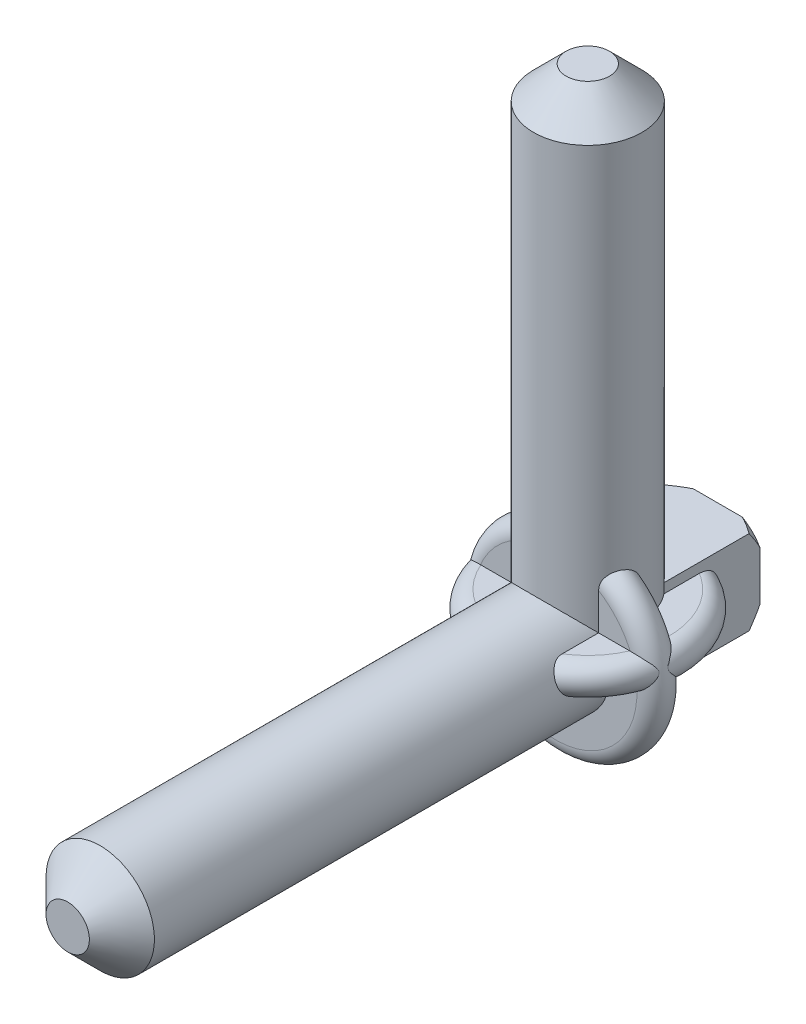
ISO-10303-21;
HEADER;
FILE_DESCRIPTION(('STEP AP214'),'2;1');
FILE_NAME('part.step','',(''),(''),'','','');
FILE_SCHEMA(('AUTOMOTIVE_DESIGN { 1 0 10303 214 1 1 1 1 }'));
ENDSEC;
DATA;
#1=APPLICATION_CONTEXT('core data for automotive mechanical design processes');
#2=APPLICATION_PROTOCOL_DEFINITION('international standard','automotive_design',2000,#1);
#3=PRODUCT_CONTEXT('',#1,'mechanical');
#4=PRODUCT('Part','Part','',(#3));
#5=PRODUCT_RELATED_PRODUCT_CATEGORY('part','',(#4));
#6=PRODUCT_DEFINITION_FORMATION('','',#4);
#7=PRODUCT_DEFINITION_CONTEXT('part definition',#1,'design');
#8=PRODUCT_DEFINITION('design','',#6,#7);
#9=PRODUCT_DEFINITION_SHAPE('','',#8);
#10=(LENGTH_UNIT() NAMED_UNIT(*) SI_UNIT(.MILLI.,.METRE.));
#11=(NAMED_UNIT(*) PLANE_ANGLE_UNIT() SI_UNIT($,.RADIAN.));
#12=(NAMED_UNIT(*) SI_UNIT($,.STERADIAN.) SOLID_ANGLE_UNIT());
#13=UNCERTAINTY_MEASURE_WITH_UNIT(LENGTH_MEASURE(1.E-05),#10,'distance_accuracy_value','');
#14=(GEOMETRIC_REPRESENTATION_CONTEXT(3) GLOBAL_UNCERTAINTY_ASSIGNED_CONTEXT((#13)) GLOBAL_UNIT_ASSIGNED_CONTEXT((#10,
#11,#12)) REPRESENTATION_CONTEXT('',''));
#15=CARTESIAN_POINT('',(0.,0.,0.));
#16=DIRECTION('',(0.,0.,1.));
#17=DIRECTION('',(1.,0.,0.));
#18=AXIS2_PLACEMENT_3D('',#15,#16,#17);
#19=CARTESIAN_POINT('',(0.,1.5,0.));
#20=DIRECTION('',(0.,-1.,0.));
#21=DIRECTION('',(0.,0.,-1.));
#22=AXIS2_PLACEMENT_3D('',#19,#20,#21);
#23=TOROIDAL_SURFACE('',#22,7.5,1.5);
#24=CARTESIAN_POINT('',(0.,0.,0.));
#25=DIRECTION('',(0.,1.,0.));
#26=DIRECTION('',(0.,0.,1.));
#27=AXIS2_PLACEMENT_3D('',#24,#25,#26);
#28=CIRCLE('',#27,7.5);
#29=CARTESIAN_POINT('',(0.,0.,7.5));
#30=VERTEX_POINT('',#29);
#31=EDGE_CURVE('E61',#30,#30,#28,.F.);
#32=ORIENTED_EDGE('',*,*,#31,.F.);
#33=EDGE_LOOP('',(#32));
#34=FACE_BOUND('',#33,.T.);
#35=CARTESIAN_POINT('',(0.,3.,0.));
#36=DIRECTION('',(0.,-1.,0.));
#37=DIRECTION('',(0.,0.,-1.));
#38=AXIS2_PLACEMENT_3D('',#35,#36,#37);
#39=CIRCLE('',#38,7.5);
#40=CARTESIAN_POINT('',(0.,3.,-7.5));
#41=VERTEX_POINT('',#40);
#42=EDGE_CURVE('E12',#41,#41,#39,.F.);
#43=ORIENTED_EDGE('',*,*,#42,.F.);
#44=EDGE_LOOP('',(#43));
#45=FACE_BOUND('',#44,.T.);
#46=ADVANCED_FACE('F54',(#34,#45),#23,.T.);
#47=CARTESIAN_POINT('',(0.,45.,0.));
#48=DIRECTION('',(0.,-1.,0.));
#49=DIRECTION('',(0.,0.,-1.));
#50=AXIS2_PLACEMENT_3D('',#47,#48,#49);
#51=CYLINDRICAL_SURFACE('',#50,5.);
#52=CARTESIAN_POINT('',(0.,42.,0.));
#53=DIRECTION('',(0.,1.,0.));
#54=DIRECTION('',(0.,0.,1.));
#55=AXIS2_PLACEMENT_3D('',#52,#53,#54);
#56=CIRCLE('',#55,5.);
#57=CARTESIAN_POINT('',(0.,42.,-5.));
#58=VERTEX_POINT('',#57);
#59=EDGE_CURVE('E69',#58,#58,#56,.F.);
#60=CARTESIAN_POINT('',(0.,3.,0.));
#61=DIRECTION('',(0.,-1.,0.));
#62=DIRECTION('',(0.,0.,-1.));
#63=AXIS2_PLACEMENT_3D('',#60,#61,#62);
#64=CIRCLE('',#63,5.);
#65=CARTESIAN_POINT('',(0.,3.00000000000001,-5.));
#66=VERTEX_POINT('',#65);
#67=EDGE_CURVE('E65',#66,#66,#64,.T.);
#68=CARTESIAN_POINT('',(0.,42.,-5.));
#69=CARTESIAN_POINT('',(0.,41.59375,-5.));
#70=CARTESIAN_POINT('',(0.,41.1875,-5.));
#71=CARTESIAN_POINT('',(0.,40.375,-5.));
#72=CARTESIAN_POINT('',(0.,39.96875,-5.));
#73=CARTESIAN_POINT('',(0.,39.15625,-5.));
#74=CARTESIAN_POINT('',(0.,38.75,-5.));
#75=CARTESIAN_POINT('',(0.,37.9375,-5.));
#76=CARTESIAN_POINT('',(0.,37.53125,-5.));
#77=CARTESIAN_POINT('',(0.,36.71875,-5.));
#78=CARTESIAN_POINT('',(0.,36.3125,-5.));
#79=CARTESIAN_POINT('',(0.,35.5,-5.));
#80=CARTESIAN_POINT('',(0.,35.09375,-5.));
#81=CARTESIAN_POINT('',(0.,34.28125,-5.));
#82=CARTESIAN_POINT('',(0.,33.875,-5.));
#83=CARTESIAN_POINT('',(0.,33.0625,-5.));
#84=CARTESIAN_POINT('',(0.,32.65625,-5.));
#85=CARTESIAN_POINT('',(0.,31.84375,-5.));
#86=CARTESIAN_POINT('',(0.,31.4375,-5.));
#87=CARTESIAN_POINT('',(0.,30.625,-5.));
#88=CARTESIAN_POINT('',(0.,30.21875,-5.));
#89=CARTESIAN_POINT('',(0.,29.40625,-5.));
#90=CARTESIAN_POINT('',(0.,29.,-5.));
#91=CARTESIAN_POINT('',(0.,28.1875,-5.));
#92=CARTESIAN_POINT('',(0.,27.78125,-5.));
#93=CARTESIAN_POINT('',(0.,26.96875,-5.));
#94=CARTESIAN_POINT('',(0.,26.5625,-5.));
#95=CARTESIAN_POINT('',(0.,25.75,-5.));
#96=CARTESIAN_POINT('',(0.,25.34375,-5.));
#97=CARTESIAN_POINT('',(0.,24.53125,-5.));
#98=CARTESIAN_POINT('',(0.,24.125,-5.));
#99=CARTESIAN_POINT('',(0.,23.3125,-5.));
#100=CARTESIAN_POINT('',(0.,22.90625,-5.));
#101=CARTESIAN_POINT('',(0.,22.09375,-5.));
#102=CARTESIAN_POINT('',(0.,21.6875,-5.));
#103=CARTESIAN_POINT('',(0.,20.875,-5.));
#104=CARTESIAN_POINT('',(0.,20.46875,-5.));
#105=CARTESIAN_POINT('',(0.,19.65625,-5.));
#106=CARTESIAN_POINT('',(0.,19.25,-5.));
#107=CARTESIAN_POINT('',(0.,18.4375,-5.));
#108=CARTESIAN_POINT('',(0.,18.03125,-5.));
#109=CARTESIAN_POINT('',(0.,17.21875,-5.));
#110=CARTESIAN_POINT('',(0.,16.8125,-5.));
#111=CARTESIAN_POINT('',(0.,16.,-5.));
#112=CARTESIAN_POINT('',(0.,15.59375,-5.));
#113=CARTESIAN_POINT('',(0.,14.78125,-5.));
#114=CARTESIAN_POINT('',(0.,14.375,-5.));
#115=CARTESIAN_POINT('',(0.,13.5625,-5.));
#116=CARTESIAN_POINT('',(0.,13.15625,-5.));
#117=CARTESIAN_POINT('',(0.,12.34375,-5.));
#118=CARTESIAN_POINT('',(0.,11.9375,-5.));
#119=CARTESIAN_POINT('',(0.,11.125,-5.));
#120=CARTESIAN_POINT('',(0.,10.71875,-5.));
#121=CARTESIAN_POINT('',(0.,9.90625000000001,-5.));
#122=CARTESIAN_POINT('',(0.,9.50000000000001,-5.));
#123=CARTESIAN_POINT('',(0.,8.68750000000001,-5.));
#124=CARTESIAN_POINT('',(0.,8.28125000000001,-5.));
#125=CARTESIAN_POINT('',(0.,7.46875000000001,-5.));
#126=CARTESIAN_POINT('',(0.,7.06250000000001,-5.));
#127=CARTESIAN_POINT('',(0.,6.25000000000001,-5.));
#128=CARTESIAN_POINT('',(0.,5.84375000000001,-5.));
#129=CARTESIAN_POINT('',(0.,5.03125000000001,-5.));
#130=CARTESIAN_POINT('',(0.,4.62500000000001,-5.));
#131=CARTESIAN_POINT('',(0.,3.81250000000001,-5.));
#132=CARTESIAN_POINT('',(0.,3.40625000000001,-5.));
#133=CARTESIAN_POINT('',(0.,3.00000000000001,-5.));
#134=B_SPLINE_CURVE_WITH_KNOTS('',3,(#68,#69,#70,#71,#72,#73,#74,#75,#76,#77,#78,#79,#80,#81,
#82,#83,#84,#85,#86,#87,#88,#89,#90,#91,#92,#93,#94,#95,#96,#97,#98,#99,#100,#101,#102,#103,
#104,#105,#106,#107,#108,#109,#110,#111,#112,#113,#114,#115,#116,#117,#118,#119,#120,#121,#122,
#123,#124,#125,#126,#127,#128,#129,#130,#131,#132,#133),.UNSPECIFIED.,.F.,.F.,(4,2,2,2,2,2,2,2,
2,2,2,2,2,2,2,2,2,2,2,2,2,2,2,2,2,2,2,2,2,2,2,2,4),(0.,1.21875,2.4375,3.65624999999999,4.875,
6.09374999999999,7.31249999999999,8.53125,9.74999999999999,10.96875,12.1875,13.40625,14.625,
15.84375,17.0625,18.28125,19.5,20.71875,21.9375,23.15625,24.375,25.59375,26.8125,28.03125,29.25,
30.46875,31.6875,32.90625,34.125,35.34375,36.5625,37.78125,39.),.UNSPECIFIED.);
#135=EDGE_CURVE('BSEAM90',#58,#66,#134,.T.);
#136=ORIENTED_EDGE('',*,*,#59,.T.);
#137=ORIENTED_EDGE('',*,*,#67,.F.);
#138=ORIENTED_EDGE('',*,*,#135,.T.);
#139=ORIENTED_EDGE('',*,*,#135,.F.);
#140=EDGE_LOOP('',(#136,#138,#137,#139));
#141=FACE_BOUND('',#140,.T.);
#142=ADVANCED_FACE('F90',(#141),#51,.T.);
#143=CARTESIAN_POINT('',(0.,45.,0.));
#144=DIRECTION('',(0.,1.,0.));
#145=DIRECTION('',(0.,0.,1.));
#146=AXIS2_PLACEMENT_3D('',#143,#144,#145);
#147=PLANE('',#146);
#148=CARTESIAN_POINT('',(0.,45.,0.));
#149=DIRECTION('',(0.,1.,0.));
#150=DIRECTION('',(0.,0.,1.));
#151=AXIS2_PLACEMENT_3D('',#148,#149,#150);
#152=CIRCLE('',#151,2.00000000000002);
#153=CARTESIAN_POINT('',(0.,45.,2.00000000000002));
#154=VERTEX_POINT('',#153);
#155=EDGE_CURVE('E74',#154,#154,#152,.T.);
#156=ORIENTED_EDGE('',*,*,#155,.T.);
#157=EDGE_LOOP('',(#156));
#158=FACE_BOUND('',#157,.T.);
#159=ADVANCED_FACE('F78',(#158),#147,.T.);
#160=CARTESIAN_POINT('',(0.,45.,0.));
#161=DIRECTION('',(0.,-1.,0.));
#162=DIRECTION('',(0.,0.,-1.));
#163=AXIS2_PLACEMENT_3D('',#160,#161,#162);
#164=CONICAL_SURFACE('',#163,2.00000000000002,0.785398163397447);
#165=ORIENTED_EDGE('',*,*,#59,.F.);
#166=EDGE_LOOP('',(#165));
#167=FACE_BOUND('',#166,.T.);
#168=ORIENTED_EDGE('',*,*,#155,.F.);
#169=EDGE_LOOP('',(#168));
#170=FACE_BOUND('',#169,.T.);
#171=ADVANCED_FACE('F80',(#167,#170),#164,.T.);
#172=CARTESIAN_POINT('',(0.,3.,0.));
#173=DIRECTION('',(0.,-1.,0.));
#174=DIRECTION('',(0.,0.,-1.));
#175=AXIS2_PLACEMENT_3D('',#172,#173,#174);
#176=PLANE('',#175);
#177=ORIENTED_EDGE('',*,*,#42,.T.);
#178=EDGE_LOOP('',(#177));
#179=FACE_BOUND('',#178,.T.);
#180=ORIENTED_EDGE('',*,*,#67,.T.);
#181=EDGE_LOOP('',(#180));
#182=FACE_BOUND('',#181,.T.);
#183=ADVANCED_FACE('F82',(#179,#182),#176,.F.);
#184=CARTESIAN_POINT('',(0.,0.,0.));
#185=DIRECTION('',(0.,1.,0.));
#186=DIRECTION('',(0.,0.,1.));
#187=AXIS2_PLACEMENT_3D('',#184,#185,#186);
#188=PLANE('',#187);
#189=ORIENTED_EDGE('',*,*,#31,.T.);
#190=EDGE_LOOP('',(#189));
#191=FACE_BOUND('',#190,.T.);
#192=ADVANCED_FACE('F88',(#191),#188,.F.);
#193=CLOSED_SHELL('',(#46,#142,#159,#171,#183,#192));
#194=MANIFOLD_SOLID_BREP('B2',#193);
#195=CARTESIAN_POINT('',(0.,0.,1.49954257660824));
#196=DIRECTION('',(0.,0.,-1.));
#197=DIRECTION('',(-1.,0.,0.));
#198=AXIS2_PLACEMENT_3D('',#195,#196,#197);
#199=TOROIDAL_SURFACE('',#198,7.53704134094666,1.5);
#200=CARTESIAN_POINT('',(0.,0.,0.));
#201=DIRECTION('',(0.,0.,1.));
#202=DIRECTION('',(1.,0.,0.));
#203=AXIS2_PLACEMENT_3D('',#200,#201,#202);
#204=CIRCLE('',#203,7.57408268189333);
#205=CARTESIAN_POINT('',(7.57408268189333,0.,0.));
#206=VERTEX_POINT('',#205);
#207=EDGE_CURVE('E259',#206,#206,#204,.T.);
#208=ORIENTED_EDGE('',*,*,#207,.T.);
#209=EDGE_LOOP('',(#208));
#210=FACE_BOUND('',#209,.T.);
#211=CARTESIAN_POINT('',(0.,0.,2.99954257660824));
#212=DIRECTION('',(0.,0.,-1.));
#213=DIRECTION('',(-1.,0.,0.));
#214=AXIS2_PLACEMENT_3D('',#211,#212,#213);
#215=CIRCLE('',#214,7.53704134094666);
#216=CARTESIAN_POINT('',(-7.53704134094666,0.,2.99954257660824));
#217=VERTEX_POINT('',#216);
#218=EDGE_CURVE('E269',#217,#217,#215,.T.);
#219=ORIENTED_EDGE('',*,*,#218,.T.);
#220=EDGE_LOOP('',(#219));
#221=FACE_BOUND('',#220,.T.);
#222=ADVANCED_FACE('F159',(#210,#221),#199,.T.);
#223=CARTESIAN_POINT('',(0.,0.,48.));
#224=DIRECTION('',(0.,0.,-1.));
#225=DIRECTION('',(-1.,0.,0.));
#226=AXIS2_PLACEMENT_3D('',#223,#224,#225);
#227=PLANE('',#226);
#228=CARTESIAN_POINT('',(0.,0.,48.));
#229=DIRECTION('',(0.,0.,-1.));
#230=DIRECTION('',(-1.,0.,0.));
#231=AXIS2_PLACEMENT_3D('',#228,#229,#230);
#232=CIRCLE('',#231,2.00000000000001);
#233=CARTESIAN_POINT('',(-2.00000000000001,0.,48.));
#234=VERTEX_POINT('',#233);
#235=EDGE_CURVE('E278',#234,#234,#232,.T.);
#236=ORIENTED_EDGE('',*,*,#235,.F.);
#237=EDGE_LOOP('',(#236));
#238=FACE_BOUND('',#237,.T.);
#239=ADVANCED_FACE('F353',(#238),#227,.F.);
#240=CARTESIAN_POINT('',(0.,0.,48.));
#241=DIRECTION('',(0.,0.,-1.));
#242=DIRECTION('',(-1.,0.,0.));
#243=AXIS2_PLACEMENT_3D('',#240,#241,#242);
#244=CONICAL_SURFACE('',#243,2.00000000000001,0.785398163397446);
#245=CARTESIAN_POINT('',(0.,0.,45.));
#246=DIRECTION('',(0.,0.,-1.));
#247=DIRECTION('',(-1.,0.,0.));
#248=AXIS2_PLACEMENT_3D('',#245,#246,#247);
#249=CIRCLE('',#248,5.);
#250=CARTESIAN_POINT('',(-4.99999999999999,0.,45.));
#251=VERTEX_POINT('',#250);
#252=EDGE_CURVE('E275',#251,#251,#249,.T.);
#253=ORIENTED_EDGE('',*,*,#252,.F.);
#254=EDGE_LOOP('',(#253));
#255=FACE_BOUND('',#254,.T.);
#256=ORIENTED_EDGE('',*,*,#235,.T.);
#257=EDGE_LOOP('',(#256));
#258=FACE_BOUND('',#257,.T.);
#259=ADVANCED_FACE('F358',(#255,#258),#244,.T.);
#260=CARTESIAN_POINT('',(0.,0.,0.));
#261=DIRECTION('',(0.,0.,-1.));
#262=DIRECTION('',(-1.,0.,0.));
#263=AXIS2_PLACEMENT_3D('',#260,#261,#262);
#264=CYLINDRICAL_SURFACE('',#263,5.);
#265=CARTESIAN_POINT('',(0.,0.,2.99954257660824));
#266=DIRECTION('',(0.,0.,-1.));
#267=DIRECTION('',(-1.,0.,0.));
#268=AXIS2_PLACEMENT_3D('',#265,#266,#267);
#269=CIRCLE('',#268,4.99999999999999);
#270=CARTESIAN_POINT('',(-4.99999999999999,0.,2.99954257660824));
#271=VERTEX_POINT('',#270);
#272=EDGE_CURVE('E272',#271,#271,#269,.T.);
#273=ORIENTED_EDGE('',*,*,#272,.F.);
#274=EDGE_LOOP('',(#273));
#275=FACE_BOUND('',#274,.T.);
#276=ORIENTED_EDGE('',*,*,#252,.T.);
#277=EDGE_LOOP('',(#276));
#278=FACE_BOUND('',#277,.T.);
#279=ADVANCED_FACE('F368',(#275,#278),#264,.T.);
#280=CARTESIAN_POINT('',(-4.99999999999999,0.,2.99954257660824));
#281=DIRECTION('',(0.,0.,-1.));
#282=DIRECTION('',(-1.,0.,0.));
#283=AXIS2_PLACEMENT_3D('',#280,#281,#282);
#284=PLANE('',#283);
#285=ORIENTED_EDGE('',*,*,#218,.F.);
#286=EDGE_LOOP('',(#285));
#287=FACE_BOUND('',#286,.T.);
#288=ORIENTED_EDGE('',*,*,#272,.T.);
#289=EDGE_LOOP('',(#288));
#290=FACE_BOUND('',#289,.T.);
#291=ADVANCED_FACE('F364',(#287,#290),#284,.F.);
#292=CARTESIAN_POINT('',(-7.5,0.,0.));
#293=DIRECTION('',(0.,0.,1.));
#294=DIRECTION('',(1.,0.,0.));
#295=AXIS2_PLACEMENT_3D('',#292,#293,#294);
#296=PLANE('',#295);
#297=DIRECTION('',(0.,-1.,0.));
#298=VECTOR('',#297,1.);
#299=CARTESIAN_POINT('',(3.88908729652601,3.88908729652601,0.));
#300=LINE('',#299,#298);
#301=CARTESIAN_POINT('',(3.88908729652601,3.88908729652601,0.));
#302=VERTEX_POINT('',#301);
#303=CARTESIAN_POINT('',(3.88908729652601,-3.88908729652601,0.));
#304=VERTEX_POINT('',#303);
#305=EDGE_CURVE('E246',#302,#304,#300,.T.);
#306=ORIENTED_EDGE('',*,*,#305,.F.);
#307=DIRECTION('',(1.,0.,0.));
#308=VECTOR('',#307,1.);
#309=CARTESIAN_POINT('',(3.88908729652601,3.88908729652601,0.));
#310=LINE('',#309,#308);
#311=CARTESIAN_POINT('',(-3.88908729652601,3.88908729652601,0.));
#312=VERTEX_POINT('',#311);
#313=EDGE_CURVE('E183',#312,#302,#310,.T.);
#314=ORIENTED_EDGE('',*,*,#313,.F.);
#315=DIRECTION('',(0.,1.,0.));
#316=VECTOR('',#315,1.);
#317=CARTESIAN_POINT('',(-3.88908729652601,3.88908729652601,0.));
#318=LINE('',#317,#316);
#319=CARTESIAN_POINT('',(-3.88908729652601,-3.88908729652601,0.));
#320=VERTEX_POINT('',#319);
#321=EDGE_CURVE('E243',#320,#312,#318,.T.);
#322=ORIENTED_EDGE('',*,*,#321,.F.);
#323=DIRECTION('',(-1.,0.,0.));
#324=VECTOR('',#323,1.);
#325=CARTESIAN_POINT('',(3.88908729652601,-3.88908729652601,0.));
#326=LINE('',#325,#324);
#327=EDGE_CURVE('E252',#304,#320,#326,.T.);
#328=ORIENTED_EDGE('',*,*,#327,.F.);
#329=EDGE_LOOP('',(#306,#314,#322,#328));
#330=FACE_BOUND('',#329,.T.);
#331=ORIENTED_EDGE('',*,*,#207,.F.);
#332=EDGE_LOOP('',(#331));
#333=FACE_BOUND('',#332,.T.);
#334=ADVANCED_FACE('F241',(#330,#333),#296,.F.);
#335=CARTESIAN_POINT('',(3.88908729652601,3.88908729652601,25.8162189847481));
#336=DIRECTION('',(0.,1.,0.));
#337=DIRECTION('',(0.,0.,1.));
#338=AXIS2_PLACEMENT_3D('',#335,#336,#337);
#339=PLANE('',#338);
#340=DIRECTION('',(0.,0.,-1.));
#341=VECTOR('',#340,1.);
#342=CARTESIAN_POINT('',(-3.88908729652601,3.88908729652601,25.8162189847481));
#343=LINE('',#342,#341);
#344=CARTESIAN_POINT('',(-3.88908729652601,3.88908729652601,-11.));
#345=VERTEX_POINT('',#344);
#346=EDGE_CURVE('E230',#312,#345,#343,.T.);
#347=ORIENTED_EDGE('',*,*,#346,.F.);
#348=ORIENTED_EDGE('',*,*,#313,.T.);
#349=DIRECTION('',(0.,0.,-1.));
#350=VECTOR('',#349,1.);
#351=CARTESIAN_POINT('',(3.88908729652601,3.88908729652601,25.8162189847481));
#352=LINE('',#351,#350);
#353=CARTESIAN_POINT('',(3.88908729652601,3.88908729652601,-11.));
#354=VERTEX_POINT('',#353);
#355=EDGE_CURVE('E188',#302,#354,#352,.T.);
#356=ORIENTED_EDGE('',*,*,#355,.T.);
#357=CARTESIAN_POINT('',(-3.88978729652601,3.88908729652601,-10.9995050029824));
#358=CARTESIAN_POINT('',(-3.78108369336855,3.88908729652601,-11.0763519078416));
#359=CARTESIAN_POINT('',(-3.67163260877479,3.88908729652601,-11.1521649922041));
#360=CARTESIAN_POINT('',(-3.45093033281997,3.88908729652601,-11.3012287873298));
#361=CARTESIAN_POINT('',(-3.33967835451337,3.88908729652601,-11.3744783311237));
#362=CARTESIAN_POINT('',(-3.11376459857949,3.88908729652601,-11.5187454667472));
#363=CARTESIAN_POINT('',(-2.99907758942493,3.88908729652601,-11.5897237645149));
#364=CARTESIAN_POINT('',(-2.76736027517317,3.88908729652601,-11.727724627306));
#365=CARTESIAN_POINT('',(-2.65033023979367,3.88908729652601,-11.7947476441753));
#366=CARTESIAN_POINT('',(-2.40987073792604,3.88908729652601,-11.9259406979572));
#367=CARTESIAN_POINT('',(-2.28635560527038,3.88908729652601,-11.9899559053949));
#368=CARTESIAN_POINT('',(-2.03618307879466,3.88908729652601,-12.1114857471477));
#369=CARTESIAN_POINT('',(-1.9095250936363,3.88908729652601,-12.1689991466409));
#370=CARTESIAN_POINT('',(-1.525608164993,3.88908729652601,-12.3288271806211));
#371=CARTESIAN_POINT('',(-1.26295503167271,3.88908729652601,-12.4192622779044));
#372=CARTESIAN_POINT('',(-0.867412663725976,3.88908729652601,-12.5172571812076));
#373=CARTESIAN_POINT('',(-0.739063924774483,3.88908729652601,-12.5433775346429));
#374=CARTESIAN_POINT('',(-0.480394446215664,3.88908729652601,-12.5834351359055));
#375=CARTESIAN_POINT('',(-0.350073282693113,3.88908729652601,-12.5973697258187));
#376=CARTESIAN_POINT('',(-0.0905175397892483,3.88908729652601,-12.6119873684757));
#377=CARTESIAN_POINT('',(0.0387066140747044,3.88908729652601,-12.6128536862105));
#378=CARTESIAN_POINT('',(0.296593475126116,3.88908729652601,-12.6017480484666));
#379=CARTESIAN_POINT('',(0.425256179667228,3.88908729652601,-12.5897760325409));
#380=CARTESIAN_POINT('',(0.679965963744885,3.88908729652601,-12.5539197818217));
#381=CARTESIAN_POINT('',(0.806025005448717,3.88908729652601,-12.5301188904681));
#382=CARTESIAN_POINT('',(1.05573497768834,3.88908729652601,-12.4719970012519));
#383=CARTESIAN_POINT('',(1.17938440235939,3.88908729652601,-12.4376696358967));
#384=CARTESIAN_POINT('',(1.42539134157302,3.88908729652601,-12.3595958129107));
#385=CARTESIAN_POINT('',(1.54771168374905,3.88908729652601,-12.315733694317));
#386=CARTESIAN_POINT('',(1.78932464784705,3.88908729652601,-12.2204721519484));
#387=CARTESIAN_POINT('',(1.90861770691972,3.88908729652601,-12.169073823779));
#388=CARTESIAN_POINT('',(2.19351522202659,3.88908729652601,-12.0374301943781));
#389=CARTESIAN_POINT('',(2.35768516455932,3.88908729652601,-11.9540939987656));
#390=CARTESIAN_POINT('',(2.68109944528291,3.88908729652601,-11.7782552552018));
#391=CARTESIAN_POINT('',(2.8403404830074,3.88908729652601,-11.6857467324143));
#392=CARTESIAN_POINT('',(3.14985005595836,3.88908729652601,-11.4968010585993));
#393=CARTESIAN_POINT('',(3.30024422234143,3.88908729652601,-11.4005684052412));
#394=CARTESIAN_POINT('',(3.52323025103755,3.88908729652601,-11.252612192772));
#395=CARTESIAN_POINT('',(3.59706112925623,3.88908729652601,-11.2027375542533));
#396=CARTESIAN_POINT('',(3.74396924633303,3.88908729652601,-11.1019023782328));
#397=CARTESIAN_POINT('',(3.81704654581192,3.88908729652601,-11.0509419291051));
#398=CARTESIAN_POINT('',(3.88978729652601,3.88908729652601,-10.9995050029824));
#399=B_SPLINE_CURVE_WITH_KNOTS('',3,(#357,#358,#359,#360,#361,#362,#363,#364,#365,#366,#367,
#368,#369,#370,#371,#372,#373,#374,#375,#376,#377,#378,#379,#380,#381,#382,#383,#384,#385,#386,
#387,#388,#389,#390,#391,#392,#393,#394,#395,#396,#397,#398),.UNSPECIFIED.,.F.,.F.,(4,2,2,2,2,2,
2,2,2,2,2,2,2,2,2,2,2,2,2,2,4),(0.,0.399384944315372,0.798949391548146,1.20350341944569,
1.60801114183076,2.02517246102459,2.44241287477624,3.27189771118466,3.66435868136198,
4.05690523234999,4.44394164406653,4.83097987808236,5.21532898974421,5.59991105538195,
5.98944824008372,6.37892885036908,6.93084202725827,7.48311711122266,8.01862763050061,
8.28591460136134,8.55317990021174),.UNSPECIFIED.);
#400=CARTESIAN_POINT('',(2.26384628453435,3.88908729652601,-12.));
#401=VERTEX_POINT('',#400);
#402=EDGE_CURVE('E285',#401,#354,#399,.T.);
#403=ORIENTED_EDGE('',*,*,#402,.F.);
#404=DIRECTION('',(1.,0.,0.));
#405=VECTOR('',#404,1.);
#406=CARTESIAN_POINT('',(3.88908729652601,3.88908729652601,-12.));
#407=LINE('',#406,#405);
#408=CARTESIAN_POINT('',(-2.26384628453435,3.88908729652601,-12.));
#409=VERTEX_POINT('',#408);
#410=EDGE_CURVE('E237',#409,#401,#407,.T.);
#411=ORIENTED_EDGE('',*,*,#410,.F.);
#412=EDGE_CURVE('E233',#345,#409,#399,.T.);
#413=ORIENTED_EDGE('',*,*,#412,.F.);
#414=EDGE_LOOP('',(#347,#348,#356,#403,#411,#413));
#415=FACE_BOUND('',#414,.T.);
#416=ADVANCED_FACE('F231',(#415),#339,.T.);
#417=CARTESIAN_POINT('',(3.88908729652601,3.88908729652601,25.8162189847481));
#418=DIRECTION('',(1.,0.,0.));
#419=DIRECTION('',(0.,0.,-1.));
#420=AXIS2_PLACEMENT_3D('',#417,#418,#419);
#421=PLANE('',#420);
#422=ORIENTED_EDGE('',*,*,#355,.F.);
#423=ORIENTED_EDGE('',*,*,#305,.T.);
#424=DIRECTION('',(0.,0.,-1.));
#425=VECTOR('',#424,1.);
#426=CARTESIAN_POINT('',(3.88908729652601,-3.88908729652601,25.8162189847481));
#427=LINE('',#426,#425);
#428=CARTESIAN_POINT('',(3.88908729652601,-3.88908729652601,-11.));
#429=VERTEX_POINT('',#428);
#430=EDGE_CURVE('E262',#304,#429,#427,.T.);
#431=ORIENTED_EDGE('',*,*,#430,.T.);
#432=CARTESIAN_POINT('',(3.88908729652601,3.88978729652601,-10.9995050029824));
#433=CARTESIAN_POINT('',(3.88908729652601,3.78108369336854,-11.0763519078416));
#434=CARTESIAN_POINT('',(3.88908729652601,3.67163260877478,-11.1521649922041));
#435=CARTESIAN_POINT('',(3.88908729652601,3.45093033281996,-11.3012287873298));
#436=CARTESIAN_POINT('',(3.88908729652601,3.33967835451337,-11.3744783311237));
#437=CARTESIAN_POINT('',(3.88908729652601,3.11376459857949,-11.5187454667472));
#438=CARTESIAN_POINT('',(3.88908729652601,2.99907758942493,-11.5897237645149));
#439=CARTESIAN_POINT('',(3.88908729652601,2.76736027517317,-11.727724627306));
#440=CARTESIAN_POINT('',(3.88908729652601,2.65033023979366,-11.7947476441753));
#441=CARTESIAN_POINT('',(3.88908729652601,2.40987073792604,-11.9259406979572));
#442=CARTESIAN_POINT('',(3.88908729652601,2.28635560527038,-11.9899559053949));
#443=CARTESIAN_POINT('',(3.88908729652601,2.03618307879466,-12.1114857471477));
#444=CARTESIAN_POINT('',(3.88908729652601,1.9095250936363,-12.1689991466409));
#445=CARTESIAN_POINT('',(3.88908729652601,1.52560816499299,-12.3288271806211));
#446=CARTESIAN_POINT('',(3.88908729652601,1.26295503167271,-12.4192622779044));
#447=CARTESIAN_POINT('',(3.88908729652601,0.867412663725975,-12.5172571812076));
#448=CARTESIAN_POINT('',(3.88908729652601,0.739063924774482,-12.5433775346429));
#449=CARTESIAN_POINT('',(3.88908729652601,0.480394446215663,-12.5834351359055));
#450=CARTESIAN_POINT('',(3.88908729652601,0.350073282693111,-12.5973697258187));
#451=CARTESIAN_POINT('',(3.88908729652601,0.0905175397892465,-12.6119873684757));
#452=CARTESIAN_POINT('',(3.88908729652601,-0.0387066140747065,-12.6128536862105));
#453=CARTESIAN_POINT('',(3.88908729652601,-0.296593475126118,-12.6017480484666));
#454=CARTESIAN_POINT('',(3.88908729652601,-0.42525617966723,-12.5897760325409));
#455=CARTESIAN_POINT('',(3.88908729652601,-0.679965963744886,-12.5539197818217));
#456=CARTESIAN_POINT('',(3.88908729652601,-0.806025005448718,-12.5301188904681));
#457=CARTESIAN_POINT('',(3.88908729652601,-1.05573497768834,-12.4719970012519));
#458=CARTESIAN_POINT('',(3.88908729652601,-1.17938440235939,-12.4376696358967));
#459=CARTESIAN_POINT('',(3.88908729652601,-1.42539134157302,-12.3595958129108));
#460=CARTESIAN_POINT('',(3.88908729652601,-1.54771168374905,-12.315733694317));
#461=CARTESIAN_POINT('',(3.88908729652601,-1.78932464784705,-12.2204721519484));
#462=CARTESIAN_POINT('',(3.88908729652601,-1.90861770691972,-12.169073823779));
#463=CARTESIAN_POINT('',(3.88908729652601,-2.19351522202659,-12.0374301943781));
#464=CARTESIAN_POINT('',(3.88908729652601,-2.35768516455932,-11.9540939987656));
#465=CARTESIAN_POINT('',(3.88908729652601,-2.68109944528292,-11.7782552552018));
#466=CARTESIAN_POINT('',(3.88908729652601,-2.8403404830074,-11.6857467324143));
#467=CARTESIAN_POINT('',(3.88908729652601,-3.14985005595837,-11.4968010585993));
#468=CARTESIAN_POINT('',(3.88908729652601,-3.30024422234143,-11.4005684052412));
#469=CARTESIAN_POINT('',(3.88908729652601,-3.52323025103755,-11.252612192772));
#470=CARTESIAN_POINT('',(3.88908729652601,-3.59706112925623,-11.2027375542533));
#471=CARTESIAN_POINT('',(3.88908729652601,-3.74396924633303,-11.1019023782328));
#472=CARTESIAN_POINT('',(3.88908729652601,-3.81704654581192,-11.0509419291051));
#473=CARTESIAN_POINT('',(3.88908729652601,-3.88978729652601,-10.9995050029824));
#474=B_SPLINE_CURVE_WITH_KNOTS('',3,(#432,#433,#434,#435,#436,#437,#438,#439,#440,#441,#442,
#443,#444,#445,#446,#447,#448,#449,#450,#451,#452,#453,#454,#455,#456,#457,#458,#459,#460,#461,
#462,#463,#464,#465,#466,#467,#468,#469,#470,#471,#472,#473),.UNSPECIFIED.,.F.,.F.,(4,2,2,2,2,2,
2,2,2,2,2,2,2,2,2,2,2,2,2,2,4),(0.,0.399384944315371,0.798949391548146,1.20350341944569,
1.60801114183076,2.02517246102459,2.44241287477624,3.27189771118466,3.66435868136198,
4.05690523234999,4.44394164406653,4.83097987808236,5.2153289897442,5.59991105538195,
5.98944824008372,6.37892885036908,6.93084202725827,7.48311711122266,8.01862763050061,
8.28591460136134,8.55317990021174),.UNSPECIFIED.);
#475=CARTESIAN_POINT('',(3.88908729652601,-2.26384628453435,-12.));
#476=VERTEX_POINT('',#475);
#477=EDGE_CURVE('E321',#476,#429,#474,.T.);
#478=ORIENTED_EDGE('',*,*,#477,.F.);
#479=DIRECTION('',(0.,-1.,0.));
#480=VECTOR('',#479,1.);
#481=CARTESIAN_POINT('',(3.88908729652601,3.88908729652601,-12.));
#482=LINE('',#481,#480);
#483=CARTESIAN_POINT('',(3.88908729652601,2.26384628453435,-12.));
#484=VERTEX_POINT('',#483);
#485=EDGE_CURVE('E238',#484,#476,#482,.T.);
#486=ORIENTED_EDGE('',*,*,#485,.F.);
#487=EDGE_CURVE('E294',#354,#484,#474,.T.);
#488=ORIENTED_EDGE('',*,*,#487,.F.);
#489=EDGE_LOOP('',(#422,#423,#431,#478,#486,#488));
#490=FACE_BOUND('',#489,.T.);
#491=ADVANCED_FACE('F302',(#490),#421,.T.);
#492=CARTESIAN_POINT('',(3.88908729652601,-3.88908729652601,25.8162189847481));
#493=DIRECTION('',(0.,-1.,0.));
#494=DIRECTION('',(0.,0.,-1.));
#495=AXIS2_PLACEMENT_3D('',#492,#493,#494);
#496=PLANE('',#495);
#497=ORIENTED_EDGE('',*,*,#430,.F.);
#498=ORIENTED_EDGE('',*,*,#327,.T.);
#499=DIRECTION('',(0.,0.,-1.));
#500=VECTOR('',#499,1.);
#501=CARTESIAN_POINT('',(-3.88908729652601,-3.88908729652601,25.8162189847481));
#502=LINE('',#501,#500);
#503=CARTESIAN_POINT('',(-3.88908729652601,-3.88908729652601,-11.));
#504=VERTEX_POINT('',#503);
#505=EDGE_CURVE('E250',#320,#504,#502,.T.);
#506=ORIENTED_EDGE('',*,*,#505,.T.);
#507=CARTESIAN_POINT('',(3.88978729652601,-3.88908729652601,-10.9995050029824));
#508=CARTESIAN_POINT('',(3.78108369336854,-3.88908729652601,-11.0763519078416));
#509=CARTESIAN_POINT('',(3.67163260877478,-3.88908729652601,-11.1521649922041));
#510=CARTESIAN_POINT('',(3.45093033281996,-3.88908729652601,-11.3012287873298));
#511=CARTESIAN_POINT('',(3.33967835451337,-3.88908729652601,-11.3744783311237));
#512=CARTESIAN_POINT('',(3.11376459857949,-3.88908729652601,-11.5187454667472));
#513=CARTESIAN_POINT('',(2.99907758942492,-3.88908729652601,-11.5897237645149));
#514=CARTESIAN_POINT('',(2.76736027517317,-3.88908729652601,-11.727724627306));
#515=CARTESIAN_POINT('',(2.65033023979366,-3.88908729652601,-11.7947476441753));
#516=CARTESIAN_POINT('',(2.40987073792604,-3.88908729652601,-11.9259406979572));
#517=CARTESIAN_POINT('',(2.28635560527038,-3.88908729652601,-11.9899559053949));
#518=CARTESIAN_POINT('',(2.03618307879466,-3.88908729652601,-12.1114857471477));
#519=CARTESIAN_POINT('',(1.90952509363629,-3.88908729652601,-12.1689991466409));
#520=CARTESIAN_POINT('',(1.52560816499299,-3.88908729652601,-12.3288271806211));
#521=CARTESIAN_POINT('',(1.2629550316727,-3.88908729652601,-12.4192622779044));
#522=CARTESIAN_POINT('',(0.867412663725972,-3.88908729652601,-12.5172571812076));
#523=CARTESIAN_POINT('',(0.739063924774478,-3.88908729652601,-12.5433775346429));
#524=CARTESIAN_POINT('',(0.480394446215659,-3.88908729652601,-12.5834351359055));
#525=CARTESIAN_POINT('',(0.350073282693107,-3.88908729652601,-12.5973697258187));
#526=CARTESIAN_POINT('',(0.0905175397892425,-3.88908729652601,-12.6119873684756));
#527=CARTESIAN_POINT('',(-0.0387066140747102,-3.88908729652601,-12.6128536862105));
#528=CARTESIAN_POINT('',(-0.296593475126122,-3.88908729652601,-12.6017480484666));
#529=CARTESIAN_POINT('',(-0.425256179667234,-3.88908729652601,-12.5897760325409));
#530=CARTESIAN_POINT('',(-0.679965963744891,-3.88908729652601,-12.5539197818217));
#531=CARTESIAN_POINT('',(-0.806025005448722,-3.88908729652601,-12.5301188904681));
#532=CARTESIAN_POINT('',(-1.05573497768835,-3.88908729652601,-12.4719970012519));
#533=CARTESIAN_POINT('',(-1.1793844023594,-3.88908729652601,-12.4376696358967));
#534=CARTESIAN_POINT('',(-1.42539134157302,-3.88908729652601,-12.3595958129107));
#535=CARTESIAN_POINT('',(-1.54771168374905,-3.88908729652601,-12.315733694317));
#536=CARTESIAN_POINT('',(-1.78932464784706,-3.88908729652601,-12.2204721519484));
#537=CARTESIAN_POINT('',(-1.90861770691972,-3.88908729652601,-12.169073823779));
#538=CARTESIAN_POINT('',(-2.1935152220266,-3.88908729652601,-12.0374301943781));
#539=CARTESIAN_POINT('',(-2.35768516455932,-3.88908729652601,-11.9540939987656));
#540=CARTESIAN_POINT('',(-2.68109944528292,-3.88908729652601,-11.7782552552018));
#541=CARTESIAN_POINT('',(-2.84034048300741,-3.88908729652601,-11.6857467324143));
#542=CARTESIAN_POINT('',(-3.14985005595837,-3.88908729652601,-11.4968010585993));
#543=CARTESIAN_POINT('',(-3.30024422234144,-3.88908729652601,-11.4005684052412));
#544=CARTESIAN_POINT('',(-3.52323025103756,-3.88908729652601,-11.252612192772));
#545=CARTESIAN_POINT('',(-3.59706112925624,-3.88908729652601,-11.2027375542533));
#546=CARTESIAN_POINT('',(-3.74396924633303,-3.88908729652601,-11.1019023782328));
#547=CARTESIAN_POINT('',(-3.81704654581193,-3.88908729652601,-11.0509419291051));
#548=CARTESIAN_POINT('',(-3.88978729652601,-3.88908729652601,-10.9995050029824));
#549=B_SPLINE_CURVE_WITH_KNOTS('',3,(#507,#508,#509,#510,#511,#512,#513,#514,#515,#516,#517,
#518,#519,#520,#521,#522,#523,#524,#525,#526,#527,#528,#529,#530,#531,#532,#533,#534,#535,#536,
#537,#538,#539,#540,#541,#542,#543,#544,#545,#546,#547,#548),.UNSPECIFIED.,.F.,.F.,(4,2,2,2,2,2,
2,2,2,2,2,2,2,2,2,2,2,2,2,2,4),(0.,0.399384944315371,0.798949391548146,1.20350341944569,
1.60801114183076,2.02517246102459,2.44241287477624,3.27189771118466,3.66435868136198,
4.05690523234999,4.44394164406653,4.83097987808236,5.21532898974421,5.59991105538195,
5.98944824008372,6.37892885036908,6.93084202725827,7.48311711122266,8.01862763050061,
8.28591460136134,8.55317990021174),.UNSPECIFIED.);
#550=CARTESIAN_POINT('',(-2.26384628453435,-3.88908729652601,-12.));
#551=VERTEX_POINT('',#550);
#552=EDGE_CURVE('E175',#551,#504,#549,.T.);
#553=ORIENTED_EDGE('',*,*,#552,.F.);
#554=DIRECTION('',(-1.,0.,0.));
#555=VECTOR('',#554,1.);
#556=CARTESIAN_POINT('',(3.88908729652601,-3.88908729652601,-12.));
#557=LINE('',#556,#555);
#558=CARTESIAN_POINT('',(2.26384628453435,-3.88908729652601,-12.));
#559=VERTEX_POINT('',#558);
#560=EDGE_CURVE('E265',#559,#551,#557,.T.);
#561=ORIENTED_EDGE('',*,*,#560,.F.);
#562=EDGE_CURVE('E165',#429,#559,#549,.T.);
#563=ORIENTED_EDGE('',*,*,#562,.F.);
#564=EDGE_LOOP('',(#497,#498,#506,#553,#561,#563));
#565=FACE_BOUND('',#564,.T.);
#566=ADVANCED_FACE('F305',(#565),#496,.T.);
#567=CARTESIAN_POINT('',(-3.88908729652601,3.88908729652601,25.8162189847481));
#568=DIRECTION('',(-1.,0.,0.));
#569=DIRECTION('',(0.,0.,1.));
#570=AXIS2_PLACEMENT_3D('',#567,#568,#569);
#571=PLANE('',#570);
#572=ORIENTED_EDGE('',*,*,#505,.F.);
#573=ORIENTED_EDGE('',*,*,#321,.T.);
#574=ORIENTED_EDGE('',*,*,#346,.T.);
#575=CARTESIAN_POINT('',(-3.88908729652601,-3.88978729652601,-10.9995050029824));
#576=CARTESIAN_POINT('',(-3.88908729652601,-3.78108369336854,-11.0763519078416));
#577=CARTESIAN_POINT('',(-3.88908729652601,-3.67163260877478,-11.1521649922041));
#578=CARTESIAN_POINT('',(-3.88908729652601,-3.45093033281996,-11.3012287873298));
#579=CARTESIAN_POINT('',(-3.88908729652601,-3.33967835451337,-11.3744783311237));
#580=CARTESIAN_POINT('',(-3.88908729652601,-3.11376459857949,-11.5187454667472));
#581=CARTESIAN_POINT('',(-3.88908729652601,-2.99907758942493,-11.5897237645149));
#582=CARTESIAN_POINT('',(-3.88908729652601,-2.76736027517317,-11.727724627306));
#583=CARTESIAN_POINT('',(-3.88908729652601,-2.65033023979366,-11.7947476441753));
#584=CARTESIAN_POINT('',(-3.88908729652601,-2.40987073792604,-11.9259406979572));
#585=CARTESIAN_POINT('',(-3.88908729652601,-2.28635560527038,-11.9899559053949));
#586=CARTESIAN_POINT('',(-3.88908729652601,-2.03618307879466,-12.1114857471477));
#587=CARTESIAN_POINT('',(-3.88908729652601,-1.9095250936363,-12.1689991466409));
#588=CARTESIAN_POINT('',(-3.88908729652601,-1.52560816499299,-12.3288271806211));
#589=CARTESIAN_POINT('',(-3.88908729652601,-1.2629550316727,-12.4192622779044));
#590=CARTESIAN_POINT('',(-3.88908729652601,-0.867412663725973,-12.5172571812076));
#591=CARTESIAN_POINT('',(-3.88908729652601,-0.739063924774479,-12.5433775346429));
#592=CARTESIAN_POINT('',(-3.88908729652601,-0.48039444621566,-12.5834351359055));
#593=CARTESIAN_POINT('',(-3.88908729652601,-0.350073282693109,-12.5973697258187));
#594=CARTESIAN_POINT('',(-3.88908729652601,-0.0905175397892436,-12.6119873684756));
#595=CARTESIAN_POINT('',(-3.88908729652601,0.0387066140747093,-12.6128536862105));
#596=CARTESIAN_POINT('',(-3.88908729652601,0.296593475126121,-12.6017480484666));
#597=CARTESIAN_POINT('',(-3.88908729652601,0.425256179667233,-12.5897760325409));
#598=CARTESIAN_POINT('',(-3.88908729652601,0.67996596374489,-12.5539197818217));
#599=CARTESIAN_POINT('',(-3.88908729652601,0.806025005448722,-12.5301188904681));
#600=CARTESIAN_POINT('',(-3.88908729652601,1.05573497768835,-12.4719970012519));
#601=CARTESIAN_POINT('',(-3.88908729652601,1.1793844023594,-12.4376696358967));
#602=CARTESIAN_POINT('',(-3.88908729652601,1.42539134157302,-12.3595958129107));
#603=CARTESIAN_POINT('',(-3.88908729652601,1.54771168374905,-12.315733694317));
#604=CARTESIAN_POINT('',(-3.88908729652601,1.78932464784706,-12.2204721519484));
#605=CARTESIAN_POINT('',(-3.88908729652601,1.90861770691972,-12.169073823779));
#606=CARTESIAN_POINT('',(-3.88908729652601,2.1935152220266,-12.0374301943781));
#607=CARTESIAN_POINT('',(-3.88908729652601,2.35768516455932,-11.9540939987656));
#608=CARTESIAN_POINT('',(-3.88908729652601,2.68109944528292,-11.7782552552018));
#609=CARTESIAN_POINT('',(-3.88908729652601,2.8403404830074,-11.6857467324143));
#610=CARTESIAN_POINT('',(-3.88908729652601,3.14985005595837,-11.4968010585993));
#611=CARTESIAN_POINT('',(-3.88908729652601,3.30024422234143,-11.4005684052412));
#612=CARTESIAN_POINT('',(-3.88908729652601,3.52323025103755,-11.252612192772));
#613=CARTESIAN_POINT('',(-3.88908729652601,3.59706112925623,-11.2027375542533));
#614=CARTESIAN_POINT('',(-3.88908729652601,3.74396924633303,-11.1019023782328));
#615=CARTESIAN_POINT('',(-3.88908729652601,3.81704654581192,-11.0509419291051));
#616=CARTESIAN_POINT('',(-3.88908729652601,3.88978729652601,-10.9995050029824));
#617=B_SPLINE_CURVE_WITH_KNOTS('',3,(#575,#576,#577,#578,#579,#580,#581,#582,#583,#584,#585,
#586,#587,#588,#589,#590,#591,#592,#593,#594,#595,#596,#597,#598,#599,#600,#601,#602,#603,#604,
#605,#606,#607,#608,#609,#610,#611,#612,#613,#614,#615,#616),.UNSPECIFIED.,.F.,.F.,(4,2,2,2,2,2,
2,2,2,2,2,2,2,2,2,2,2,2,2,2,4),(0.,0.399384944315372,0.798949391548145,1.20350341944569,
1.60801114183076,2.02517246102459,2.44241287477624,3.27189771118466,3.66435868136198,
4.05690523234999,4.44394164406653,4.83097987808236,5.21532898974421,5.59991105538196,
5.98944824008373,6.37892885036908,6.93084202725827,7.48311711122266,8.01862763050061,
8.28591460136134,8.55317990021174),.UNSPECIFIED.);
#618=CARTESIAN_POINT('',(-3.88908729652601,2.26384628453434,-12.));
#619=VERTEX_POINT('',#618);
#620=EDGE_CURVE('E176',#619,#345,#617,.T.);
#621=ORIENTED_EDGE('',*,*,#620,.F.);
#622=DIRECTION('',(0.,1.,0.));
#623=VECTOR('',#622,1.);
#624=CARTESIAN_POINT('',(-3.88908729652601,3.88908729652601,-12.));
#625=LINE('',#624,#623);
#626=CARTESIAN_POINT('',(-3.88908729652601,-2.26384628453434,-12.));
#627=VERTEX_POINT('',#626);
#628=EDGE_CURVE('E256',#627,#619,#625,.T.);
#629=ORIENTED_EDGE('',*,*,#628,.F.);
#630=EDGE_CURVE('E52',#504,#627,#617,.T.);
#631=ORIENTED_EDGE('',*,*,#630,.F.);
#632=EDGE_LOOP('',(#572,#573,#574,#621,#629,#631));
#633=FACE_BOUND('',#632,.T.);
#634=ADVANCED_FACE('F248',(#633),#571,.T.);
#635=CARTESIAN_POINT('',(0.,0.,-12.));
#636=DIRECTION('',(0.,0.,1.));
#637=DIRECTION('',(1.,0.,0.));
#638=AXIS2_PLACEMENT_3D('',#635,#636,#637);
#639=CONICAL_SURFACE('',#638,4.5,0.785398163397446);
#640=ORIENTED_EDGE('',*,*,#477,.T.);
#641=ORIENTED_EDGE('',*,*,#562,.T.);
#642=CARTESIAN_POINT('',(0.,0.,-12.));
#643=DIRECTION('',(0.,0.,-1.));
#644=DIRECTION('',(-1.,0.,0.));
#645=AXIS2_PLACEMENT_3D('',#642,#643,#644);
#646=CIRCLE('',#645,4.5);
#647=EDGE_CURVE('E336',#476,#559,#646,.T.);
#648=ORIENTED_EDGE('',*,*,#647,.F.);
#649=EDGE_LOOP('',(#640,#641,#648));
#650=FACE_BOUND('',#649,.T.);
#651=ADVANCED_FACE('F314',(#650),#639,.T.);
#652=ORIENTED_EDGE('',*,*,#402,.T.);
#653=ORIENTED_EDGE('',*,*,#487,.T.);
#654=EDGE_CURVE('E286',#401,#484,#646,.T.);
#655=ORIENTED_EDGE('',*,*,#654,.F.);
#656=EDGE_LOOP('',(#652,#653,#655));
#657=FACE_BOUND('',#656,.T.);
#658=ADVANCED_FACE('F329',(#657),#639,.T.);
#659=EDGE_CURVE('E282',#619,#409,#646,.T.);
#660=ORIENTED_EDGE('',*,*,#659,.F.);
#661=ORIENTED_EDGE('',*,*,#620,.T.);
#662=ORIENTED_EDGE('',*,*,#412,.T.);
#663=EDGE_LOOP('',(#660,#661,#662));
#664=FACE_BOUND('',#663,.T.);
#665=ADVANCED_FACE('F346',(#664),#639,.T.);
#666=ORIENTED_EDGE('',*,*,#552,.T.);
#667=ORIENTED_EDGE('',*,*,#630,.T.);
#668=EDGE_CURVE('E281',#551,#627,#646,.T.);
#669=ORIENTED_EDGE('',*,*,#668,.F.);
#670=EDGE_LOOP('',(#666,#667,#669));
#671=FACE_BOUND('',#670,.T.);
#672=ADVANCED_FACE('F162',(#671),#639,.T.);
#673=CARTESIAN_POINT('',(0.,0.,-12.));
#674=DIRECTION('',(0.,0.,-1.));
#675=DIRECTION('',(-1.,0.,0.));
#676=AXIS2_PLACEMENT_3D('',#673,#674,#675);
#677=PLANE('',#676);
#678=ORIENTED_EDGE('',*,*,#668,.T.);
#679=ORIENTED_EDGE('',*,*,#628,.T.);
#680=ORIENTED_EDGE('',*,*,#659,.T.);
#681=ORIENTED_EDGE('',*,*,#410,.T.);
#682=ORIENTED_EDGE('',*,*,#654,.T.);
#683=ORIENTED_EDGE('',*,*,#485,.T.);
#684=ORIENTED_EDGE('',*,*,#647,.T.);
#685=ORIENTED_EDGE('',*,*,#560,.T.);
#686=EDGE_LOOP('',(#678,#679,#680,#681,#682,#683,#684,#685));
#687=FACE_BOUND('',#686,.T.);
#688=ADVANCED_FACE('F315',(#687),#677,.T.);
#689=CLOSED_SHELL('',(#222,#239,#259,#279,#291,#334,#416,#491,#566,#634,#651,#658,#665,#672,#688));
#690=MANIFOLD_SOLID_BREP('B7',#689);
#691=ADVANCED_BREP_SHAPE_REPRESENTATION('',(#18,#194,#690),#14);
#692=SHAPE_DEFINITION_REPRESENTATION(#9,#691);
ENDSEC;
END-ISO-10303-21;
